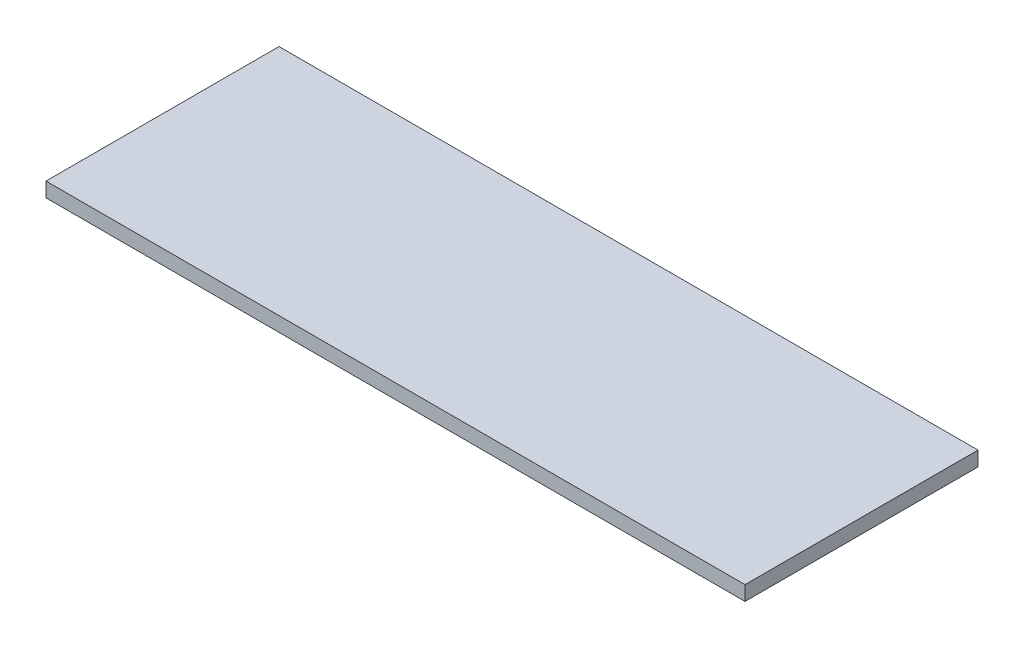
ISO-10303-21;
HEADER;
FILE_DESCRIPTION(('STEP AP214'),'2;1');
FILE_NAME('part.step','',(''),(''),'','','');
FILE_SCHEMA(('AUTOMOTIVE_DESIGN { 1 0 10303 214 1 1 1 1 }'));
ENDSEC;
DATA;
#1=APPLICATION_CONTEXT('core data for automotive mechanical design processes');
#2=APPLICATION_PROTOCOL_DEFINITION('international standard','automotive_design',2000,#1);
#3=PRODUCT_CONTEXT('',#1,'mechanical');
#4=PRODUCT('Part','Part','',(#3));
#5=PRODUCT_RELATED_PRODUCT_CATEGORY('part','',(#4));
#6=PRODUCT_DEFINITION_FORMATION('','',#4);
#7=PRODUCT_DEFINITION_CONTEXT('part definition',#1,'design');
#8=PRODUCT_DEFINITION('design','',#6,#7);
#9=PRODUCT_DEFINITION_SHAPE('','',#8);
#10=(LENGTH_UNIT() NAMED_UNIT(*) SI_UNIT(.MILLI.,.METRE.));
#11=(NAMED_UNIT(*) PLANE_ANGLE_UNIT() SI_UNIT($,.RADIAN.));
#12=(NAMED_UNIT(*) SI_UNIT($,.STERADIAN.) SOLID_ANGLE_UNIT());
#13=UNCERTAINTY_MEASURE_WITH_UNIT(LENGTH_MEASURE(1.E-05),#10,'distance_accuracy_value','');
#14=(GEOMETRIC_REPRESENTATION_CONTEXT(3) GLOBAL_UNCERTAINTY_ASSIGNED_CONTEXT((#13)) GLOBAL_UNIT_ASSIGNED_CONTEXT((#10,
#11,#12)) REPRESENTATION_CONTEXT('',''));
#15=CARTESIAN_POINT('',(0.,0.,0.));
#16=DIRECTION('',(0.,0.,1.));
#17=DIRECTION('',(1.,0.,0.));
#18=AXIS2_PLACEMENT_3D('',#15,#16,#17);
#19=CARTESIAN_POINT('',(0.,1.5875,-25.4));
#20=DIRECTION('',(1.,0.,0.));
#21=DIRECTION('',(0.,0.,-1.));
#22=AXIS2_PLACEMENT_3D('',#19,#20,#21);
#23=PLANE('',#22);
#24=DIRECTION('',(0.,0.,1.));
#25=VECTOR('',#24,1.);
#26=CARTESIAN_POINT('',(0.,0.,-25.4));
#27=LINE('',#26,#25);
#28=CARTESIAN_POINT('',(0.,0.,-25.4));
#29=VERTEX_POINT('',#28);
#30=CARTESIAN_POINT('',(0.,0.,0.));
#31=VERTEX_POINT('',#30);
#32=EDGE_CURVE('E107',#29,#31,#27,.T.);
#33=ORIENTED_EDGE('',*,*,#32,.T.);
#34=DIRECTION('',(0.,-1.,0.));
#35=VECTOR('',#34,1.);
#36=CARTESIAN_POINT('',(0.,1.5875,0.));
#37=LINE('',#36,#35);
#38=CARTESIAN_POINT('',(0.,1.5875,0.));
#39=VERTEX_POINT('',#38);
#40=EDGE_CURVE('E11',#39,#31,#37,.T.);
#41=ORIENTED_EDGE('',*,*,#40,.F.);
#42=DIRECTION('',(0.,0.,1.));
#43=VECTOR('',#42,1.);
#44=CARTESIAN_POINT('',(0.,1.5875,-25.4));
#45=LINE('',#44,#43);
#46=CARTESIAN_POINT('',(0.,1.5875,-25.4));
#47=VERTEX_POINT('',#46);
#48=EDGE_CURVE('E91',#47,#39,#45,.T.);
#49=ORIENTED_EDGE('',*,*,#48,.F.);
#50=DIRECTION('',(0.,-1.,0.));
#51=VECTOR('',#50,1.);
#52=CARTESIAN_POINT('',(0.,1.5875,-25.4));
#53=LINE('',#52,#51);
#54=EDGE_CURVE('E103',#47,#29,#53,.T.);
#55=ORIENTED_EDGE('',*,*,#54,.T.);
#56=EDGE_LOOP('',(#33,#41,#49,#55));
#57=FACE_BOUND('',#56,.T.);
#58=ADVANCED_FACE('F39',(#57),#23,.F.);
#59=CARTESIAN_POINT('',(0.,1.5875,0.));
#60=DIRECTION('',(0.,0.,-1.));
#61=DIRECTION('',(-1.,0.,0.));
#62=AXIS2_PLACEMENT_3D('',#59,#60,#61);
#63=PLANE('',#62);
#64=DIRECTION('',(1.,0.,0.));
#65=VECTOR('',#64,1.);
#66=CARTESIAN_POINT('',(0.,0.,0.));
#67=LINE('',#66,#65);
#68=CARTESIAN_POINT('',(76.2,0.,0.));
#69=VERTEX_POINT('',#68);
#70=EDGE_CURVE('E96',#31,#69,#67,.T.);
#71=ORIENTED_EDGE('',*,*,#70,.T.);
#72=DIRECTION('',(0.,-1.,0.));
#73=VECTOR('',#72,1.);
#74=CARTESIAN_POINT('',(76.2,1.5875,0.));
#75=LINE('',#74,#73);
#76=CARTESIAN_POINT('',(76.2,1.5875,0.));
#77=VERTEX_POINT('',#76);
#78=EDGE_CURVE('E48',#77,#69,#75,.T.);
#79=ORIENTED_EDGE('',*,*,#78,.F.);
#80=DIRECTION('',(1.,0.,0.));
#81=VECTOR('',#80,1.);
#82=CARTESIAN_POINT('',(0.,1.5875,0.));
#83=LINE('',#82,#81);
#84=EDGE_CURVE('E86',#39,#77,#83,.T.);
#85=ORIENTED_EDGE('',*,*,#84,.F.);
#86=ORIENTED_EDGE('',*,*,#40,.T.);
#87=EDGE_LOOP('',(#71,#79,#85,#86));
#88=FACE_BOUND('',#87,.T.);
#89=ADVANCED_FACE('F95',(#88),#63,.F.);
#90=CARTESIAN_POINT('',(76.2,1.5875,-25.4));
#91=DIRECTION('',(-1.,0.,0.));
#92=DIRECTION('',(0.,0.,1.));
#93=AXIS2_PLACEMENT_3D('',#90,#91,#92);
#94=PLANE('',#93);
#95=DIRECTION('',(0.,0.,-1.));
#96=VECTOR('',#95,1.);
#97=CARTESIAN_POINT('',(76.2,0.,-25.4));
#98=LINE('',#97,#96);
#99=CARTESIAN_POINT('',(76.2,0.,-25.4));
#100=VERTEX_POINT('',#99);
#101=EDGE_CURVE('E73',#69,#100,#98,.T.);
#102=ORIENTED_EDGE('',*,*,#101,.T.);
#103=DIRECTION('',(0.,-1.,0.));
#104=VECTOR('',#103,1.);
#105=CARTESIAN_POINT('',(76.2,1.5875,-25.4));
#106=LINE('',#105,#104);
#107=CARTESIAN_POINT('',(76.2,1.5875,-25.4));
#108=VERTEX_POINT('',#107);
#109=EDGE_CURVE('E98',#108,#100,#106,.T.);
#110=ORIENTED_EDGE('',*,*,#109,.F.);
#111=DIRECTION('',(0.,0.,-1.));
#112=VECTOR('',#111,1.);
#113=CARTESIAN_POINT('',(76.2,1.5875,-25.4));
#114=LINE('',#113,#112);
#115=EDGE_CURVE('E89',#77,#108,#114,.T.);
#116=ORIENTED_EDGE('',*,*,#115,.F.);
#117=ORIENTED_EDGE('',*,*,#78,.T.);
#118=EDGE_LOOP('',(#102,#110,#116,#117));
#119=FACE_BOUND('',#118,.T.);
#120=ADVANCED_FACE('F99',(#119),#94,.F.);
#121=CARTESIAN_POINT('',(0.,1.5875,-25.4));
#122=DIRECTION('',(0.,0.,1.));
#123=DIRECTION('',(1.,0.,0.));
#124=AXIS2_PLACEMENT_3D('',#121,#122,#123);
#125=PLANE('',#124);
#126=DIRECTION('',(-1.,0.,0.));
#127=VECTOR('',#126,1.);
#128=CARTESIAN_POINT('',(0.,0.,-25.4));
#129=LINE('',#128,#127);
#130=EDGE_CURVE('E79',#100,#29,#129,.T.);
#131=ORIENTED_EDGE('',*,*,#130,.T.);
#132=ORIENTED_EDGE('',*,*,#54,.F.);
#133=DIRECTION('',(-1.,0.,0.));
#134=VECTOR('',#133,1.);
#135=CARTESIAN_POINT('',(0.,1.5875,-25.4));
#136=LINE('',#135,#134);
#137=EDGE_CURVE('E56',#108,#47,#136,.T.);
#138=ORIENTED_EDGE('',*,*,#137,.F.);
#139=ORIENTED_EDGE('',*,*,#109,.T.);
#140=EDGE_LOOP('',(#131,#132,#138,#139));
#141=FACE_BOUND('',#140,.T.);
#142=ADVANCED_FACE('F120',(#141),#125,.F.);
#143=CARTESIAN_POINT('',(0.,1.5875,0.));
#144=DIRECTION('',(0.,1.,0.));
#145=DIRECTION('',(0.,0.,1.));
#146=AXIS2_PLACEMENT_3D('',#143,#144,#145);
#147=PLANE('',#146);
#148=ORIENTED_EDGE('',*,*,#48,.T.);
#149=ORIENTED_EDGE('',*,*,#84,.T.);
#150=ORIENTED_EDGE('',*,*,#115,.T.);
#151=ORIENTED_EDGE('',*,*,#137,.T.);
#152=EDGE_LOOP('',(#148,#149,#150,#151));
#153=FACE_BOUND('',#152,.T.);
#154=ADVANCED_FACE('F87',(#153),#147,.T.);
#155=CARTESIAN_POINT('',(0.,0.,0.));
#156=DIRECTION('',(0.,1.,0.));
#157=DIRECTION('',(0.,0.,1.));
#158=AXIS2_PLACEMENT_3D('',#155,#156,#157);
#159=PLANE('',#158);
#160=ORIENTED_EDGE('',*,*,#32,.F.);
#161=ORIENTED_EDGE('',*,*,#130,.F.);
#162=ORIENTED_EDGE('',*,*,#101,.F.);
#163=ORIENTED_EDGE('',*,*,#70,.F.);
#164=EDGE_LOOP('',(#160,#161,#162,#163));
#165=FACE_BOUND('',#164,.T.);
#166=ADVANCED_FACE('F123',(#165),#159,.F.);
#167=CLOSED_SHELL('',(#58,#89,#120,#142,#154,#166));
#168=MANIFOLD_SOLID_BREP('B2',#167);
#169=ADVANCED_BREP_SHAPE_REPRESENTATION('',(#18,#168),#14);
#170=SHAPE_DEFINITION_REPRESENTATION(#9,#169);
ENDSEC;
END-ISO-10303-21;
